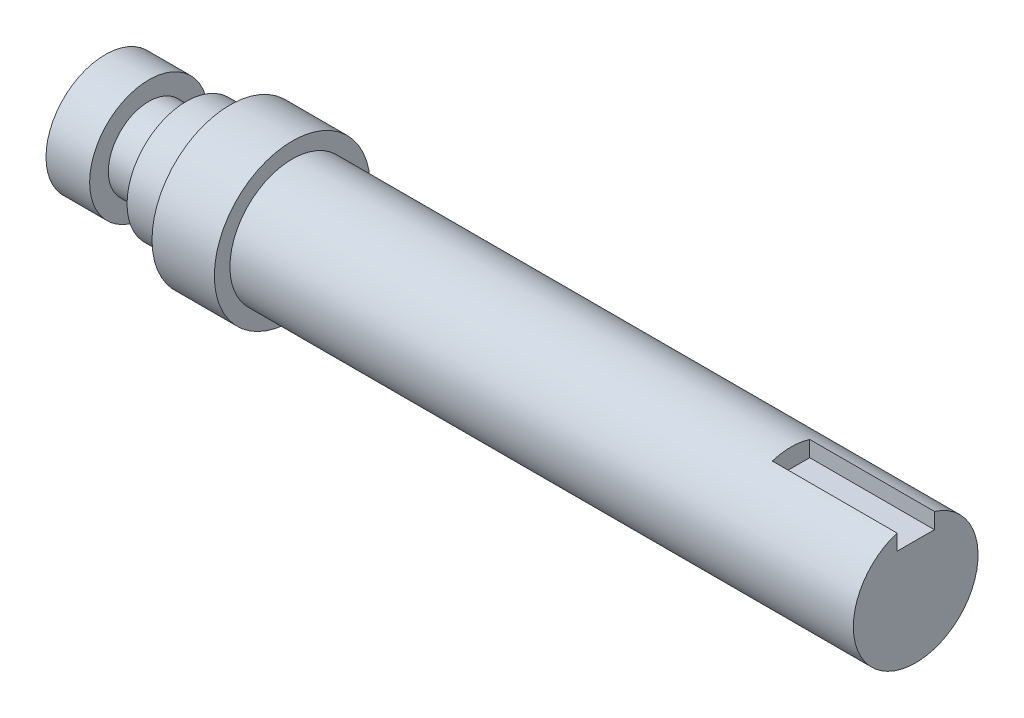
ISO-10303-21;
HEADER;
FILE_DESCRIPTION(('STEP AP214'),'2;1');
FILE_NAME('part.step','',(''),(''),'','','');
FILE_SCHEMA(('AUTOMOTIVE_DESIGN { 1 0 10303 214 1 1 1 1 }'));
ENDSEC;
DATA;
#1=APPLICATION_CONTEXT('core data for automotive mechanical design processes');
#2=APPLICATION_PROTOCOL_DEFINITION('international standard','automotive_design',2000,#1);
#3=PRODUCT_CONTEXT('',#1,'mechanical');
#4=PRODUCT('Part','Part','',(#3));
#5=PRODUCT_RELATED_PRODUCT_CATEGORY('part','',(#4));
#6=PRODUCT_DEFINITION_FORMATION('','',#4);
#7=PRODUCT_DEFINITION_CONTEXT('part definition',#1,'design');
#8=PRODUCT_DEFINITION('design','',#6,#7);
#9=PRODUCT_DEFINITION_SHAPE('','',#8);
#10=(LENGTH_UNIT() NAMED_UNIT(*) SI_UNIT(.MILLI.,.METRE.));
#11=(NAMED_UNIT(*) PLANE_ANGLE_UNIT() SI_UNIT($,.RADIAN.));
#12=(NAMED_UNIT(*) SI_UNIT($,.STERADIAN.) SOLID_ANGLE_UNIT());
#13=UNCERTAINTY_MEASURE_WITH_UNIT(LENGTH_MEASURE(1.E-05),#10,'distance_accuracy_value','');
#14=(GEOMETRIC_REPRESENTATION_CONTEXT(3) GLOBAL_UNCERTAINTY_ASSIGNED_CONTEXT((#13)) GLOBAL_UNIT_ASSIGNED_CONTEXT((#10,
#11,#12)) REPRESENTATION_CONTEXT('',''));
#15=CARTESIAN_POINT('',(0.,0.,0.));
#16=DIRECTION('',(0.,0.,1.));
#17=DIRECTION('',(1.,0.,0.));
#18=AXIS2_PLACEMENT_3D('',#15,#16,#17);
#19=CARTESIAN_POINT('',(-130.,0.,0.));
#20=DIRECTION('',(-1.,0.,0.));
#21=DIRECTION('',(0.,0.,1.));
#22=AXIS2_PLACEMENT_3D('',#19,#20,#21);
#23=CYLINDRICAL_SURFACE('',#22,9.5);
#24=CARTESIAN_POINT('',(-110.,0.,0.));
#25=DIRECTION('',(-1.,0.,0.));
#26=DIRECTION('',(0.,0.,1.));
#27=AXIS2_PLACEMENT_3D('',#24,#25,#26);
#28=CIRCLE('',#27,9.50000000000001);
#29=CARTESIAN_POINT('',(-110.,0.,9.50000000000001));
#30=VERTEX_POINT('',#29);
#31=EDGE_CURVE('E116',#30,#30,#28,.T.);
#32=ORIENTED_EDGE('',*,*,#31,.T.);
#33=EDGE_LOOP('',(#32));
#34=FACE_BOUND('',#33,.T.);
#35=CARTESIAN_POINT('',(-117.,0.,0.));
#36=DIRECTION('',(-1.,0.,0.));
#37=DIRECTION('',(0.,0.,1.));
#38=AXIS2_PLACEMENT_3D('',#35,#36,#37);
#39=CIRCLE('',#38,9.5);
#40=CARTESIAN_POINT('',(-117.,0.,9.5));
#41=VERTEX_POINT('',#40);
#42=EDGE_CURVE('E100',#41,#41,#39,.T.);
#43=ORIENTED_EDGE('',*,*,#42,.F.);
#44=EDGE_LOOP('',(#43));
#45=FACE_BOUND('',#44,.T.);
#46=ADVANCED_FACE('F35',(#34,#45),#23,.T.);
#47=CARTESIAN_POINT('',(0.,0.,0.));
#48=DIRECTION('',(-1.,0.,0.));
#49=DIRECTION('',(0.,0.,1.));
#50=AXIS2_PLACEMENT_3D('',#47,#48,#49);
#51=PLANE('',#50);
#52=CARTESIAN_POINT('',(0.,0.,0.));
#53=DIRECTION('',(-1.,0.,0.));
#54=DIRECTION('',(0.,0.,1.));
#55=AXIS2_PLACEMENT_3D('',#52,#53,#54);
#56=CIRCLE('',#55,10.);
#57=CARTESIAN_POINT('',(0.,9.53939201416945,-3.));
#58=VERTEX_POINT('',#57);
#59=CARTESIAN_POINT('',(0.,9.53939201416945,3.));
#60=VERTEX_POINT('',#59);
#61=EDGE_CURVE('E128',#58,#60,#56,.T.);
#62=ORIENTED_EDGE('',*,*,#61,.F.);
#63=DIRECTION('',(0.,1.,0.));
#64=VECTOR('',#63,1.);
#65=CARTESIAN_POINT('',(0.,12.,-3.));
#66=LINE('',#65,#64);
#67=CARTESIAN_POINT('',(0.,6.99999999999999,-3.));
#68=VERTEX_POINT('',#67);
#69=EDGE_CURVE('E80',#68,#58,#66,.T.);
#70=ORIENTED_EDGE('',*,*,#69,.F.);
#71=DIRECTION('',(0.,0.,1.));
#72=VECTOR('',#71,1.);
#73=CARTESIAN_POINT('',(0.,6.99999999999999,-3.));
#74=LINE('',#73,#72);
#75=CARTESIAN_POINT('',(0.,6.99999999999999,3.));
#76=VERTEX_POINT('',#75);
#77=EDGE_CURVE('E87',#68,#76,#74,.T.);
#78=ORIENTED_EDGE('',*,*,#77,.T.);
#79=DIRECTION('',(0.,1.,0.));
#80=VECTOR('',#79,1.);
#81=CARTESIAN_POINT('',(0.,12.,3.));
#82=LINE('',#81,#80);
#83=EDGE_CURVE('E94',#76,#60,#82,.T.);
#84=ORIENTED_EDGE('',*,*,#83,.T.);
#85=EDGE_LOOP('',(#62,#70,#78,#84));
#86=FACE_BOUND('',#85,.T.);
#87=ADVANCED_FACE('F37',(#86),#51,.F.);
#88=CARTESIAN_POINT('',(-130.,0.,0.));
#89=DIRECTION('',(-1.,0.,0.));
#90=DIRECTION('',(0.,0.,1.));
#91=AXIS2_PLACEMENT_3D('',#88,#89,#90);
#92=CYLINDRICAL_SURFACE('',#91,9.99999999999999);
#93=CARTESIAN_POINT('',(-100.,0.,0.));
#94=DIRECTION('',(-1.,0.,0.));
#95=DIRECTION('',(0.,0.,1.));
#96=AXIS2_PLACEMENT_3D('',#93,#94,#95);
#97=CIRCLE('',#96,9.99999999999999);
#98=CARTESIAN_POINT('',(-100.,0.,9.99999999999999));
#99=VERTEX_POINT('',#98);
#100=EDGE_CURVE('E125',#99,#99,#97,.T.);
#101=ORIENTED_EDGE('',*,*,#100,.F.);
#102=EDGE_LOOP('',(#101));
#103=FACE_BOUND('',#102,.T.);
#104=CARTESIAN_POINT('',(-20.,0.,0.));
#105=DIRECTION('',(-1.,0.,0.));
#106=DIRECTION('',(0.,0.,1.));
#107=AXIS2_PLACEMENT_3D('',#104,#105,#106);
#108=CIRCLE('',#107,9.99999999999999);
#109=CARTESIAN_POINT('',(-20.,9.53939201416945,3.));
#110=VERTEX_POINT('',#109);
#111=CARTESIAN_POINT('',(-20.,9.53939201416945,-3.));
#112=VERTEX_POINT('',#111);
#113=EDGE_CURVE('E43',#110,#112,#108,.T.);
#114=ORIENTED_EDGE('',*,*,#113,.T.);
#115=DIRECTION('',(-1.,0.,0.));
#116=VECTOR('',#115,1.);
#117=CARTESIAN_POINT('',(-130.,9.53939201416945,-3.));
#118=LINE('',#117,#116);
#119=EDGE_CURVE('E11',#112,#58,#118,.F.);
#120=ORIENTED_EDGE('',*,*,#119,.T.);
#121=ORIENTED_EDGE('',*,*,#61,.T.);
#122=DIRECTION('',(-1.,0.,0.));
#123=VECTOR('',#122,1.);
#124=CARTESIAN_POINT('',(-130.,9.53939201416945,3.));
#125=LINE('',#124,#123);
#126=EDGE_CURVE('E131',#110,#60,#125,.F.);
#127=ORIENTED_EDGE('',*,*,#126,.F.);
#128=EDGE_LOOP('',(#114,#120,#121,#127));
#129=FACE_BOUND('',#128,.T.);
#130=ADVANCED_FACE('F134',(#103,#129),#92,.T.);
#131=CARTESIAN_POINT('',(-100.,9.99999999999999,0.));
#132=DIRECTION('',(-1.,0.,0.));
#133=DIRECTION('',(0.,0.,1.));
#134=AXIS2_PLACEMENT_3D('',#131,#132,#133);
#135=PLANE('',#134);
#136=CARTESIAN_POINT('',(-100.,0.,0.));
#137=DIRECTION('',(-1.,0.,0.));
#138=DIRECTION('',(0.,0.,1.));
#139=AXIS2_PLACEMENT_3D('',#136,#137,#138);
#140=CIRCLE('',#139,12.5);
#141=CARTESIAN_POINT('',(-100.,0.,12.5));
#142=VERTEX_POINT('',#141);
#143=EDGE_CURVE('E122',#142,#142,#140,.T.);
#144=ORIENTED_EDGE('',*,*,#143,.F.);
#145=EDGE_LOOP('',(#144));
#146=FACE_BOUND('',#145,.T.);
#147=ORIENTED_EDGE('',*,*,#100,.T.);
#148=EDGE_LOOP('',(#147));
#149=FACE_BOUND('',#148,.T.);
#150=ADVANCED_FACE('F143',(#146,#149),#135,.F.);
#151=CARTESIAN_POINT('',(-130.,0.,0.));
#152=DIRECTION('',(-1.,0.,0.));
#153=DIRECTION('',(0.,0.,1.));
#154=AXIS2_PLACEMENT_3D('',#151,#152,#153);
#155=CYLINDRICAL_SURFACE('',#154,12.5);
#156=CARTESIAN_POINT('',(-110.,0.,0.));
#157=DIRECTION('',(-1.,0.,0.));
#158=DIRECTION('',(0.,0.,1.));
#159=AXIS2_PLACEMENT_3D('',#156,#157,#158);
#160=CIRCLE('',#159,12.5);
#161=CARTESIAN_POINT('',(-110.,0.,12.5));
#162=VERTEX_POINT('',#161);
#163=EDGE_CURVE('E119',#162,#162,#160,.T.);
#164=ORIENTED_EDGE('',*,*,#163,.F.);
#165=EDGE_LOOP('',(#164));
#166=FACE_BOUND('',#165,.T.);
#167=ORIENTED_EDGE('',*,*,#143,.T.);
#168=EDGE_LOOP('',(#167));
#169=FACE_BOUND('',#168,.T.);
#170=ADVANCED_FACE('F185',(#166,#169),#155,.T.);
#171=CARTESIAN_POINT('',(-110.,12.5,0.));
#172=DIRECTION('',(1.,0.,0.));
#173=DIRECTION('',(0.,0.,-1.));
#174=AXIS2_PLACEMENT_3D('',#171,#172,#173);
#175=PLANE('',#174);
#176=ORIENTED_EDGE('',*,*,#31,.F.);
#177=EDGE_LOOP('',(#176));
#178=FACE_BOUND('',#177,.T.);
#179=ORIENTED_EDGE('',*,*,#163,.T.);
#180=EDGE_LOOP('',(#179));
#181=FACE_BOUND('',#180,.T.);
#182=ADVANCED_FACE('F180',(#178,#181),#175,.F.);
#183=CARTESIAN_POINT('',(-117.,9.5,0.));
#184=DIRECTION('',(-1.,0.,0.));
#185=DIRECTION('',(0.,0.,1.));
#186=AXIS2_PLACEMENT_3D('',#183,#184,#185);
#187=PLANE('',#186);
#188=ORIENTED_EDGE('',*,*,#42,.T.);
#189=EDGE_LOOP('',(#188));
#190=FACE_BOUND('',#189,.T.);
#191=CARTESIAN_POINT('',(-117.,0.,0.));
#192=DIRECTION('',(-1.,0.,0.));
#193=DIRECTION('',(0.,0.,1.));
#194=AXIS2_PLACEMENT_3D('',#191,#192,#193);
#195=CIRCLE('',#194,6.5);
#196=CARTESIAN_POINT('',(-117.,0.,6.5));
#197=VERTEX_POINT('',#196);
#198=EDGE_CURVE('E110',#197,#197,#195,.T.);
#199=ORIENTED_EDGE('',*,*,#198,.F.);
#200=EDGE_LOOP('',(#199));
#201=FACE_BOUND('',#200,.T.);
#202=ADVANCED_FACE('F174',(#190,#201),#187,.T.);
#203=CARTESIAN_POINT('',(-130.,0.,0.));
#204=DIRECTION('',(-1.,0.,0.));
#205=DIRECTION('',(0.,0.,1.));
#206=AXIS2_PLACEMENT_3D('',#203,#204,#205);
#207=CYLINDRICAL_SURFACE('',#206,6.5);
#208=ORIENTED_EDGE('',*,*,#198,.T.);
#209=EDGE_LOOP('',(#208));
#210=FACE_BOUND('',#209,.T.);
#211=CARTESIAN_POINT('',(-123.,0.,0.));
#212=DIRECTION('',(-1.,0.,0.));
#213=DIRECTION('',(0.,0.,1.));
#214=AXIS2_PLACEMENT_3D('',#211,#212,#213);
#215=CIRCLE('',#214,6.5);
#216=CARTESIAN_POINT('',(-123.,0.,6.5));
#217=VERTEX_POINT('',#216);
#218=EDGE_CURVE('E107',#217,#217,#215,.T.);
#219=ORIENTED_EDGE('',*,*,#218,.F.);
#220=EDGE_LOOP('',(#219));
#221=FACE_BOUND('',#220,.T.);
#222=ADVANCED_FACE('F168',(#210,#221),#207,.T.);
#223=CARTESIAN_POINT('',(-123.,9.5,0.));
#224=DIRECTION('',(1.,0.,0.));
#225=DIRECTION('',(0.,0.,-1.));
#226=AXIS2_PLACEMENT_3D('',#223,#224,#225);
#227=PLANE('',#226);
#228=ORIENTED_EDGE('',*,*,#218,.T.);
#229=EDGE_LOOP('',(#228));
#230=FACE_BOUND('',#229,.T.);
#231=CARTESIAN_POINT('',(-123.,0.,0.));
#232=DIRECTION('',(-1.,0.,0.));
#233=DIRECTION('',(0.,0.,1.));
#234=AXIS2_PLACEMENT_3D('',#231,#232,#233);
#235=CIRCLE('',#234,9.5);
#236=CARTESIAN_POINT('',(-123.,0.,9.5));
#237=VERTEX_POINT('',#236);
#238=EDGE_CURVE('E104',#237,#237,#235,.T.);
#239=ORIENTED_EDGE('',*,*,#238,.F.);
#240=EDGE_LOOP('',(#239));
#241=FACE_BOUND('',#240,.T.);
#242=ADVANCED_FACE('F161',(#230,#241),#227,.T.);
#243=CARTESIAN_POINT('',(-130.,9.5,0.));
#244=DIRECTION('',(1.,0.,0.));
#245=DIRECTION('',(0.,0.,-1.));
#246=AXIS2_PLACEMENT_3D('',#243,#244,#245);
#247=PLANE('',#246);
#248=CARTESIAN_POINT('',(-130.,0.,0.));
#249=DIRECTION('',(-1.,0.,0.));
#250=DIRECTION('',(0.,0.,1.));
#251=AXIS2_PLACEMENT_3D('',#248,#249,#250);
#252=CIRCLE('',#251,9.5);
#253=CARTESIAN_POINT('',(-130.,0.,9.5));
#254=VERTEX_POINT('',#253);
#255=EDGE_CURVE('E113',#254,#254,#252,.T.);
#256=ORIENTED_EDGE('',*,*,#255,.T.);
#257=EDGE_LOOP('',(#256));
#258=FACE_BOUND('',#257,.T.);
#259=ADVANCED_FACE('F154',(#258),#247,.F.);
#260=ORIENTED_EDGE('',*,*,#255,.F.);
#261=EDGE_LOOP('',(#260));
#262=FACE_BOUND('',#261,.T.);
#263=ORIENTED_EDGE('',*,*,#238,.T.);
#264=EDGE_LOOP('',(#263));
#265=FACE_BOUND('',#264,.T.);
#266=ADVANCED_FACE('F147',(#262,#265),#23,.T.);
#267=CARTESIAN_POINT('',(-20.,12.,-3.));
#268=DIRECTION('',(-1.,0.,0.));
#269=DIRECTION('',(0.,0.,1.));
#270=AXIS2_PLACEMENT_3D('',#267,#268,#269);
#271=PLANE('',#270);
#272=DIRECTION('',(0.,-1.,0.));
#273=VECTOR('',#272,1.);
#274=CARTESIAN_POINT('',(-20.,12.,3.));
#275=LINE('',#274,#273);
#276=CARTESIAN_POINT('',(-20.,6.99999999999999,3.));
#277=VERTEX_POINT('',#276);
#278=EDGE_CURVE('E50',#110,#277,#275,.T.);
#279=ORIENTED_EDGE('',*,*,#278,.T.);
#280=DIRECTION('',(0.,0.,1.));
#281=VECTOR('',#280,1.);
#282=CARTESIAN_POINT('',(-20.,6.99999999999999,-3.));
#283=LINE('',#282,#281);
#284=CARTESIAN_POINT('',(-20.,6.99999999999999,-3.));
#285=VERTEX_POINT('',#284);
#286=EDGE_CURVE('E83',#285,#277,#283,.T.);
#287=ORIENTED_EDGE('',*,*,#286,.F.);
#288=DIRECTION('',(0.,-1.,0.));
#289=VECTOR('',#288,1.);
#290=CARTESIAN_POINT('',(-20.,12.,-3.));
#291=LINE('',#290,#289);
#292=EDGE_CURVE('E72',#112,#285,#291,.T.);
#293=ORIENTED_EDGE('',*,*,#292,.F.);
#294=ORIENTED_EDGE('',*,*,#113,.F.);
#295=EDGE_LOOP('',(#279,#287,#293,#294));
#296=FACE_BOUND('',#295,.T.);
#297=ADVANCED_FACE('F84',(#296),#271,.F.);
#298=CARTESIAN_POINT('',(0.,0.,-3.));
#299=DIRECTION('',(0.,0.,-1.));
#300=DIRECTION('',(-1.,0.,0.));
#301=AXIS2_PLACEMENT_3D('',#298,#299,#300);
#302=PLANE('',#301);
#303=ORIENTED_EDGE('',*,*,#292,.T.);
#304=DIRECTION('',(1.,0.,0.));
#305=VECTOR('',#304,1.);
#306=CARTESIAN_POINT('',(0.,6.99999999999999,-3.));
#307=LINE('',#306,#305);
#308=EDGE_CURVE('E76',#285,#68,#307,.T.);
#309=ORIENTED_EDGE('',*,*,#308,.T.);
#310=ORIENTED_EDGE('',*,*,#69,.T.);
#311=ORIENTED_EDGE('',*,*,#119,.F.);
#312=EDGE_LOOP('',(#303,#309,#310,#311));
#313=FACE_BOUND('',#312,.T.);
#314=ADVANCED_FACE('F74',(#313),#302,.F.);
#315=CARTESIAN_POINT('',(0.,0.,3.));
#316=DIRECTION('',(0.,0.,-1.));
#317=DIRECTION('',(-1.,0.,0.));
#318=AXIS2_PLACEMENT_3D('',#315,#316,#317);
#319=PLANE('',#318);
#320=ORIENTED_EDGE('',*,*,#126,.T.);
#321=ORIENTED_EDGE('',*,*,#83,.F.);
#322=DIRECTION('',(1.,0.,0.));
#323=VECTOR('',#322,1.);
#324=CARTESIAN_POINT('',(0.,6.99999999999999,3.));
#325=LINE('',#324,#323);
#326=EDGE_CURVE('E98',#277,#76,#325,.T.);
#327=ORIENTED_EDGE('',*,*,#326,.F.);
#328=ORIENTED_EDGE('',*,*,#278,.F.);
#329=EDGE_LOOP('',(#320,#321,#327,#328));
#330=FACE_BOUND('',#329,.T.);
#331=ADVANCED_FACE('F136',(#330),#319,.T.);
#332=CARTESIAN_POINT('',(0.,6.99999999999999,-3.));
#333=DIRECTION('',(0.,-1.,0.));
#334=DIRECTION('',(1.,0.,0.));
#335=AXIS2_PLACEMENT_3D('',#332,#333,#334);
#336=PLANE('',#335);
#337=ORIENTED_EDGE('',*,*,#326,.T.);
#338=ORIENTED_EDGE('',*,*,#77,.F.);
#339=ORIENTED_EDGE('',*,*,#308,.F.);
#340=ORIENTED_EDGE('',*,*,#286,.T.);
#341=EDGE_LOOP('',(#337,#338,#339,#340));
#342=FACE_BOUND('',#341,.T.);
#343=ADVANCED_FACE('F89',(#342),#336,.F.);
#344=CLOSED_SHELL('',(#46,#87,#130,#150,#170,#182,#202,#222,#242,#259,#266,#297,#314,#331,#343));
#345=MANIFOLD_SOLID_BREP('B2',#344);
#346=ADVANCED_BREP_SHAPE_REPRESENTATION('',(#18,#345),#14);
#347=SHAPE_DEFINITION_REPRESENTATION(#9,#346);
ENDSEC;
END-ISO-10303-21;
